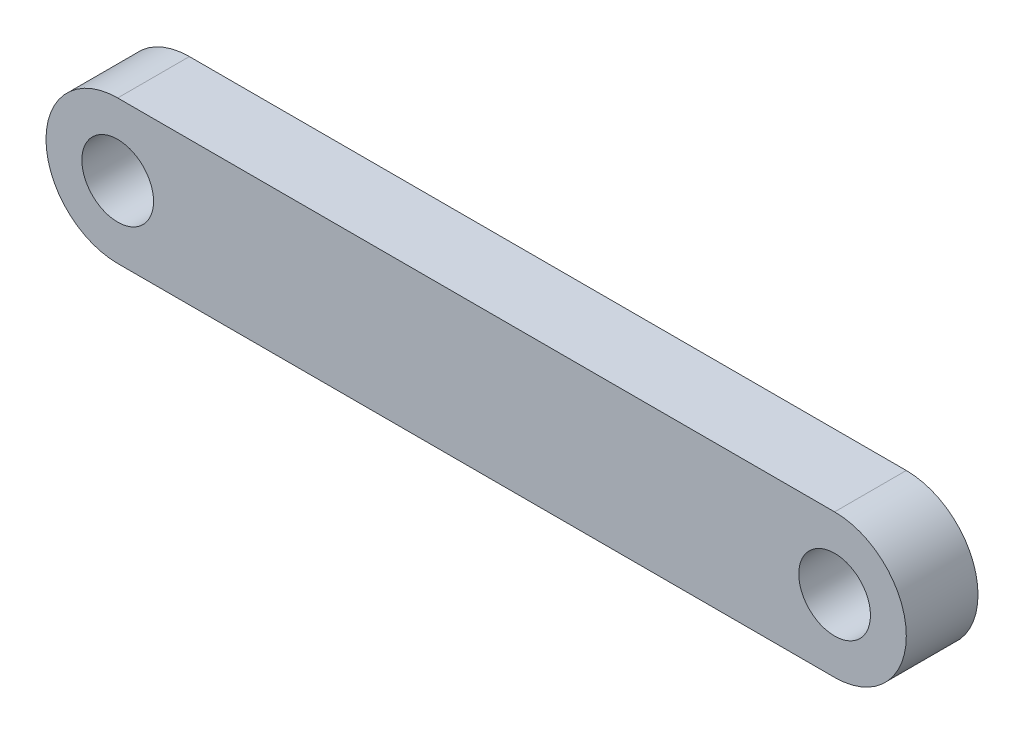
ISO-10303-21;
HEADER;
FILE_DESCRIPTION(('STEP AP214'),'2;1');
FILE_NAME('part.step','',(''),(''),'','','');
FILE_SCHEMA(('AUTOMOTIVE_DESIGN { 1 0 10303 214 1 1 1 1 }'));
ENDSEC;
DATA;
#1=APPLICATION_CONTEXT('core data for automotive mechanical design processes');
#2=APPLICATION_PROTOCOL_DEFINITION('international standard','automotive_design',2000,#1);
#3=PRODUCT_CONTEXT('',#1,'mechanical');
#4=PRODUCT('Part','Part','',(#3));
#5=PRODUCT_RELATED_PRODUCT_CATEGORY('part','',(#4));
#6=PRODUCT_DEFINITION_FORMATION('','',#4);
#7=PRODUCT_DEFINITION_CONTEXT('part definition',#1,'design');
#8=PRODUCT_DEFINITION('design','',#6,#7);
#9=PRODUCT_DEFINITION_SHAPE('','',#8);
#10=(LENGTH_UNIT() NAMED_UNIT(*) SI_UNIT(.MILLI.,.METRE.));
#11=(NAMED_UNIT(*) PLANE_ANGLE_UNIT() SI_UNIT($,.RADIAN.));
#12=(NAMED_UNIT(*) SI_UNIT($,.STERADIAN.) SOLID_ANGLE_UNIT());
#13=UNCERTAINTY_MEASURE_WITH_UNIT(LENGTH_MEASURE(1.E-05),#10,'distance_accuracy_value','');
#14=(GEOMETRIC_REPRESENTATION_CONTEXT(3) GLOBAL_UNCERTAINTY_ASSIGNED_CONTEXT((#13)) GLOBAL_UNIT_ASSIGNED_CONTEXT((#10,
#11,#12)) REPRESENTATION_CONTEXT('',''));
#15=CARTESIAN_POINT('',(0.,0.,0.));
#16=DIRECTION('',(0.,0.,1.));
#17=DIRECTION('',(1.,0.,0.));
#18=AXIS2_PLACEMENT_3D('',#15,#16,#17);
#19=CARTESIAN_POINT('',(-50.,0.,10.));
#20=DIRECTION('',(0.,0.,1.));
#21=DIRECTION('',(1.,0.,0.));
#22=AXIS2_PLACEMENT_3D('',#19,#20,#21);
#23=PLANE('',#22);
#24=CARTESIAN_POINT('',(50.,0.,10.));
#25=DIRECTION('',(0.,0.,1.));
#26=DIRECTION('',(1.,0.,0.));
#27=AXIS2_PLACEMENT_3D('',#24,#25,#26);
#28=CIRCLE('',#27,4.99999999999999);
#29=CARTESIAN_POINT('',(55.,0.,10.));
#30=VERTEX_POINT('',#29);
#31=EDGE_CURVE('E141',#30,#30,#28,.T.);
#32=ORIENTED_EDGE('',*,*,#31,.F.);
#33=EDGE_LOOP('',(#32));
#34=FACE_BOUND('',#33,.T.);
#35=CARTESIAN_POINT('',(-50.,0.,10.));
#36=DIRECTION('',(0.,0.,1.));
#37=DIRECTION('',(1.,0.,0.));
#38=AXIS2_PLACEMENT_3D('',#35,#36,#37);
#39=CIRCLE('',#38,10.);
#40=CARTESIAN_POINT('',(-50.,9.99999999999999,10.));
#41=VERTEX_POINT('',#40);
#42=CARTESIAN_POINT('',(-50.,-10.,10.));
#43=VERTEX_POINT('',#42);
#44=EDGE_CURVE('E120',#41,#43,#39,.T.);
#45=ORIENTED_EDGE('',*,*,#44,.T.);
#46=DIRECTION('',(1.,0.,0.));
#47=VECTOR('',#46,1.);
#48=CARTESIAN_POINT('',(-50.,-10.,10.));
#49=LINE('',#48,#47);
#50=CARTESIAN_POINT('',(50.,-10.,10.));
#51=VERTEX_POINT('',#50);
#52=EDGE_CURVE('E113',#43,#51,#49,.T.);
#53=ORIENTED_EDGE('',*,*,#52,.T.);
#54=CARTESIAN_POINT('',(50.,0.,10.));
#55=DIRECTION('',(0.,0.,1.));
#56=DIRECTION('',(1.,0.,0.));
#57=AXIS2_PLACEMENT_3D('',#54,#55,#56);
#58=CIRCLE('',#57,10.);
#59=CARTESIAN_POINT('',(50.,10.,10.));
#60=VERTEX_POINT('',#59);
#61=EDGE_CURVE('E119',#51,#60,#58,.T.);
#62=ORIENTED_EDGE('',*,*,#61,.T.);
#63=DIRECTION('',(1.,0.,0.));
#64=VECTOR('',#63,1.);
#65=CARTESIAN_POINT('',(-50.,9.99999999999999,10.));
#66=LINE('',#65,#64);
#67=EDGE_CURVE('E132',#41,#60,#66,.T.);
#68=ORIENTED_EDGE('',*,*,#67,.F.);
#69=EDGE_LOOP('',(#45,#53,#62,#68));
#70=FACE_BOUND('',#69,.T.);
#71=CARTESIAN_POINT('',(-50.,0.,10.));
#72=DIRECTION('',(0.,0.,1.));
#73=DIRECTION('',(1.,0.,0.));
#74=AXIS2_PLACEMENT_3D('',#71,#72,#73);
#75=CIRCLE('',#74,4.99999999999999);
#76=CARTESIAN_POINT('',(-45.,0.,10.));
#77=VERTEX_POINT('',#76);
#78=EDGE_CURVE('E161',#77,#77,#75,.T.);
#79=ORIENTED_EDGE('',*,*,#78,.F.);
#80=EDGE_LOOP('',(#79));
#81=FACE_BOUND('',#80,.T.);
#82=ADVANCED_FACE('F69',(#34,#70,#81),#23,.T.);
#83=CARTESIAN_POINT('',(-50.,0.,0.));
#84=DIRECTION('',(0.,0.,1.));
#85=DIRECTION('',(1.,0.,0.));
#86=AXIS2_PLACEMENT_3D('',#83,#84,#85);
#87=PLANE('',#86);
#88=CARTESIAN_POINT('',(-50.,0.,0.));
#89=DIRECTION('',(0.,0.,1.));
#90=DIRECTION('',(1.,0.,0.));
#91=AXIS2_PLACEMENT_3D('',#88,#89,#90);
#92=CIRCLE('',#91,10.);
#93=CARTESIAN_POINT('',(-50.,9.99999999999999,0.));
#94=VERTEX_POINT('',#93);
#95=CARTESIAN_POINT('',(-50.,-10.,0.));
#96=VERTEX_POINT('',#95);
#97=EDGE_CURVE('E138',#94,#96,#92,.T.);
#98=ORIENTED_EDGE('',*,*,#97,.F.);
#99=DIRECTION('',(1.,0.,0.));
#100=VECTOR('',#99,1.);
#101=CARTESIAN_POINT('',(-50.,9.99999999999999,0.));
#102=LINE('',#101,#100);
#103=CARTESIAN_POINT('',(50.,10.,0.));
#104=VERTEX_POINT('',#103);
#105=EDGE_CURVE('E147',#94,#104,#102,.T.);
#106=ORIENTED_EDGE('',*,*,#105,.T.);
#107=CARTESIAN_POINT('',(50.,0.,0.));
#108=DIRECTION('',(0.,0.,1.));
#109=DIRECTION('',(1.,0.,0.));
#110=AXIS2_PLACEMENT_3D('',#107,#108,#109);
#111=CIRCLE('',#110,10.);
#112=CARTESIAN_POINT('',(50.,-10.,0.));
#113=VERTEX_POINT('',#112);
#114=EDGE_CURVE('E144',#113,#104,#111,.T.);
#115=ORIENTED_EDGE('',*,*,#114,.F.);
#116=DIRECTION('',(1.,0.,0.));
#117=VECTOR('',#116,1.);
#118=CARTESIAN_POINT('',(-50.,-10.,0.));
#119=LINE('',#118,#117);
#120=EDGE_CURVE('E126',#96,#113,#119,.T.);
#121=ORIENTED_EDGE('',*,*,#120,.F.);
#122=EDGE_LOOP('',(#98,#106,#115,#121));
#123=FACE_BOUND('',#122,.T.);
#124=CARTESIAN_POINT('',(50.,0.,0.));
#125=DIRECTION('',(0.,0.,1.));
#126=DIRECTION('',(1.,0.,0.));
#127=AXIS2_PLACEMENT_3D('',#124,#125,#126);
#128=CIRCLE('',#127,4.99999999999999);
#129=CARTESIAN_POINT('',(55.,0.,0.));
#130=VERTEX_POINT('',#129);
#131=EDGE_CURVE('E157',#130,#130,#128,.T.);
#132=ORIENTED_EDGE('',*,*,#131,.T.);
#133=EDGE_LOOP('',(#132));
#134=FACE_BOUND('',#133,.T.);
#135=CARTESIAN_POINT('',(-50.,0.,0.));
#136=DIRECTION('',(0.,0.,1.));
#137=DIRECTION('',(1.,0.,0.));
#138=AXIS2_PLACEMENT_3D('',#135,#136,#137);
#139=CIRCLE('',#138,4.99999999999999);
#140=CARTESIAN_POINT('',(-45.,0.,0.));
#141=VERTEX_POINT('',#140);
#142=EDGE_CURVE('E165',#141,#141,#139,.T.);
#143=ORIENTED_EDGE('',*,*,#142,.T.);
#144=EDGE_LOOP('',(#143));
#145=FACE_BOUND('',#144,.T.);
#146=ADVANCED_FACE('F176',(#123,#134,#145),#87,.F.);
#147=CARTESIAN_POINT('',(-50.,0.,10.));
#148=DIRECTION('',(0.,0.,-1.));
#149=DIRECTION('',(-1.,0.,0.));
#150=AXIS2_PLACEMENT_3D('',#147,#148,#149);
#151=CYLINDRICAL_SURFACE('',#150,10.);
#152=ORIENTED_EDGE('',*,*,#97,.T.);
#153=DIRECTION('',(0.,0.,-1.));
#154=VECTOR('',#153,1.);
#155=CARTESIAN_POINT('',(-50.,-10.,10.));
#156=LINE('',#155,#154);
#157=EDGE_CURVE('E12',#43,#96,#156,.T.);
#158=ORIENTED_EDGE('',*,*,#157,.F.);
#159=ORIENTED_EDGE('',*,*,#44,.F.);
#160=DIRECTION('',(0.,0.,-1.));
#161=VECTOR('',#160,1.);
#162=CARTESIAN_POINT('',(-50.,9.99999999999999,10.));
#163=LINE('',#162,#161);
#164=EDGE_CURVE('E87',#41,#94,#163,.T.);
#165=ORIENTED_EDGE('',*,*,#164,.T.);
#166=EDGE_LOOP('',(#152,#158,#159,#165));
#167=FACE_BOUND('',#166,.T.);
#168=ADVANCED_FACE('F71',(#167),#151,.T.);
#169=CARTESIAN_POINT('',(-50.,-10.,10.));
#170=DIRECTION('',(0.,1.,0.));
#171=DIRECTION('',(0.,0.,1.));
#172=AXIS2_PLACEMENT_3D('',#169,#170,#171);
#173=PLANE('',#172);
#174=ORIENTED_EDGE('',*,*,#120,.T.);
#175=DIRECTION('',(0.,0.,-1.));
#176=VECTOR('',#175,1.);
#177=CARTESIAN_POINT('',(50.,-10.,10.));
#178=LINE('',#177,#176);
#179=EDGE_CURVE('E79',#51,#113,#178,.T.);
#180=ORIENTED_EDGE('',*,*,#179,.F.);
#181=ORIENTED_EDGE('',*,*,#52,.F.);
#182=ORIENTED_EDGE('',*,*,#157,.T.);
#183=EDGE_LOOP('',(#174,#180,#181,#182));
#184=FACE_BOUND('',#183,.T.);
#185=ADVANCED_FACE('F125',(#184),#173,.F.);
#186=CARTESIAN_POINT('',(50.,0.,10.));
#187=DIRECTION('',(0.,0.,-1.));
#188=DIRECTION('',(-1.,0.,0.));
#189=AXIS2_PLACEMENT_3D('',#186,#187,#188);
#190=CYLINDRICAL_SURFACE('',#189,10.);
#191=ORIENTED_EDGE('',*,*,#114,.T.);
#192=DIRECTION('',(0.,0.,-1.));
#193=VECTOR('',#192,1.);
#194=CARTESIAN_POINT('',(50.,10.,10.));
#195=LINE('',#194,#193);
#196=EDGE_CURVE('E102',#60,#104,#195,.T.);
#197=ORIENTED_EDGE('',*,*,#196,.F.);
#198=ORIENTED_EDGE('',*,*,#61,.F.);
#199=ORIENTED_EDGE('',*,*,#179,.T.);
#200=EDGE_LOOP('',(#191,#197,#198,#199));
#201=FACE_BOUND('',#200,.T.);
#202=ADVANCED_FACE('F130',(#201),#190,.T.);
#203=CARTESIAN_POINT('',(-50.,9.99999999999999,10.));
#204=DIRECTION('',(0.,1.,0.));
#205=DIRECTION('',(-1.,0.,0.));
#206=AXIS2_PLACEMENT_3D('',#203,#204,#205);
#207=PLANE('',#206);
#208=ORIENTED_EDGE('',*,*,#105,.F.);
#209=ORIENTED_EDGE('',*,*,#164,.F.);
#210=ORIENTED_EDGE('',*,*,#67,.T.);
#211=ORIENTED_EDGE('',*,*,#196,.T.);
#212=EDGE_LOOP('',(#208,#209,#210,#211));
#213=FACE_BOUND('',#212,.T.);
#214=ADVANCED_FACE('F188',(#213),#207,.T.);
#215=CARTESIAN_POINT('',(50.,0.,10.));
#216=DIRECTION('',(0.,0.,-1.));
#217=DIRECTION('',(-1.,0.,0.));
#218=AXIS2_PLACEMENT_3D('',#215,#216,#217);
#219=CYLINDRICAL_SURFACE('',#218,4.99999999999999);
#220=ORIENTED_EDGE('',*,*,#31,.T.);
#221=EDGE_LOOP('',(#220));
#222=FACE_BOUND('',#221,.T.);
#223=ORIENTED_EDGE('',*,*,#131,.F.);
#224=EDGE_LOOP('',(#223));
#225=FACE_BOUND('',#224,.T.);
#226=ADVANCED_FACE('F185',(#222,#225),#219,.F.);
#227=CARTESIAN_POINT('',(-50.,0.,10.));
#228=DIRECTION('',(0.,0.,-1.));
#229=DIRECTION('',(-1.,0.,0.));
#230=AXIS2_PLACEMENT_3D('',#227,#228,#229);
#231=CYLINDRICAL_SURFACE('',#230,4.99999999999999);
#232=ORIENTED_EDGE('',*,*,#78,.T.);
#233=EDGE_LOOP('',(#232));
#234=FACE_BOUND('',#233,.T.);
#235=ORIENTED_EDGE('',*,*,#142,.F.);
#236=EDGE_LOOP('',(#235));
#237=FACE_BOUND('',#236,.T.);
#238=ADVANCED_FACE('F173',(#234,#237),#231,.F.);
#239=CLOSED_SHELL('',(#82,#146,#168,#185,#202,#214,#226,#238));
#240=MANIFOLD_SOLID_BREP('B2',#239);
#241=ADVANCED_BREP_SHAPE_REPRESENTATION('',(#18,#240),#14);
#242=SHAPE_DEFINITION_REPRESENTATION(#9,#241);
ENDSEC;
END-ISO-10303-21;
